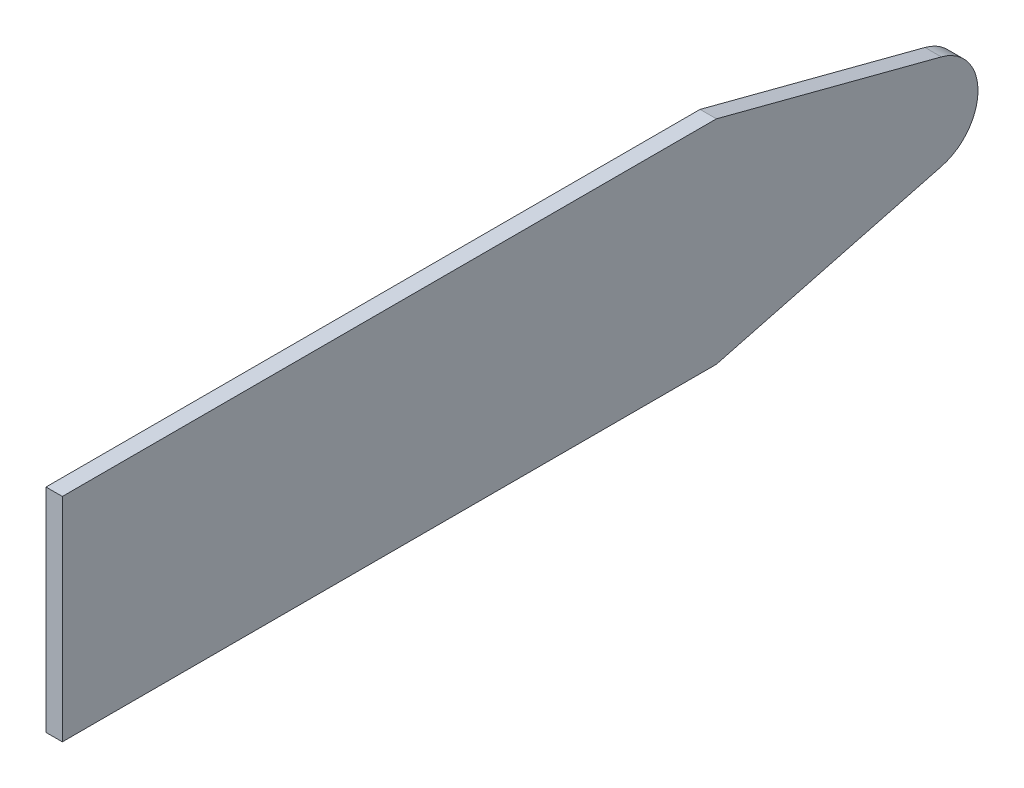
ISO-10303-21;
HEADER;
FILE_DESCRIPTION(('STEP AP214'),'2;1');
FILE_NAME('part.step','',(''),(''),'','','');
FILE_SCHEMA(('AUTOMOTIVE_DESIGN { 1 0 10303 214 1 1 1 1 }'));
ENDSEC;
DATA;
#1=APPLICATION_CONTEXT('core data for automotive mechanical design processes');
#2=APPLICATION_PROTOCOL_DEFINITION('international standard','automotive_design',2000,#1);
#3=PRODUCT_CONTEXT('',#1,'mechanical');
#4=PRODUCT('Part','Part','',(#3));
#5=PRODUCT_RELATED_PRODUCT_CATEGORY('part','',(#4));
#6=PRODUCT_DEFINITION_FORMATION('','',#4);
#7=PRODUCT_DEFINITION_CONTEXT('part definition',#1,'design');
#8=PRODUCT_DEFINITION('design','',#6,#7);
#9=PRODUCT_DEFINITION_SHAPE('','',#8);
#10=(LENGTH_UNIT() NAMED_UNIT(*) SI_UNIT(.MILLI.,.METRE.));
#11=(NAMED_UNIT(*) PLANE_ANGLE_UNIT() SI_UNIT($,.RADIAN.));
#12=(NAMED_UNIT(*) SI_UNIT($,.STERADIAN.) SOLID_ANGLE_UNIT());
#13=UNCERTAINTY_MEASURE_WITH_UNIT(LENGTH_MEASURE(1.E-05),#10,'distance_accuracy_value','');
#14=(GEOMETRIC_REPRESENTATION_CONTEXT(3) GLOBAL_UNCERTAINTY_ASSIGNED_CONTEXT((#13)) GLOBAL_UNIT_ASSIGNED_CONTEXT((#10,
#11,#12)) REPRESENTATION_CONTEXT('',''));
#15=CARTESIAN_POINT('',(0.,0.,0.));
#16=DIRECTION('',(0.,0.,1.));
#17=DIRECTION('',(1.,0.,0.));
#18=AXIS2_PLACEMENT_3D('',#15,#16,#17);
#19=CARTESIAN_POINT('',(10.,0.,0.));
#20=DIRECTION('',(-1.,0.,0.));
#21=DIRECTION('',(0.,0.,1.));
#22=AXIS2_PLACEMENT_3D('',#19,#20,#21);
#23=CYLINDRICAL_SURFACE('',#22,30.);
#24=CARTESIAN_POINT('',(0.,0.,0.));
#25=DIRECTION('',(1.,0.,0.));
#26=DIRECTION('',(0.,0.,-1.));
#27=AXIS2_PLACEMENT_3D('',#24,#25,#26);
#28=CIRCLE('',#27,30.);
#29=CARTESIAN_POINT('',(0.,-29.0242387446053,-7.58904244922575));
#30=VERTEX_POINT('',#29);
#31=CARTESIAN_POINT('',(0.,29.0242387446053,-7.58904244922576));
#32=VERTEX_POINT('',#31);
#33=EDGE_CURVE('E118',#30,#32,#28,.T.);
#34=ORIENTED_EDGE('',*,*,#33,.T.);
#35=DIRECTION('',(-1.,0.,0.));
#36=VECTOR('',#35,1.);
#37=CARTESIAN_POINT('',(10.,29.0242387446053,-7.58904244922576));
#38=LINE('',#37,#36);
#39=CARTESIAN_POINT('',(10.,29.0242387446053,-7.58904244922576));
#40=VERTEX_POINT('',#39);
#41=EDGE_CURVE('E11',#40,#32,#38,.T.);
#42=ORIENTED_EDGE('',*,*,#41,.F.);
#43=CARTESIAN_POINT('',(10.,0.,0.));
#44=DIRECTION('',(1.,0.,0.));
#45=DIRECTION('',(0.,0.,-1.));
#46=AXIS2_PLACEMENT_3D('',#43,#44,#45);
#47=CIRCLE('',#46,30.);
#48=CARTESIAN_POINT('',(10.,-29.0242387446053,-7.58904244922575));
#49=VERTEX_POINT('',#48);
#50=EDGE_CURVE('E128',#49,#40,#47,.T.);
#51=ORIENTED_EDGE('',*,*,#50,.F.);
#52=DIRECTION('',(-1.,0.,0.));
#53=VECTOR('',#52,1.);
#54=CARTESIAN_POINT('',(10.,-29.0242387446053,-7.58904244922575));
#55=LINE('',#54,#53);
#56=EDGE_CURVE('E114',#49,#30,#55,.T.);
#57=ORIENTED_EDGE('',*,*,#56,.T.);
#58=EDGE_LOOP('',(#34,#42,#51,#57));
#59=FACE_BOUND('',#58,.T.);
#60=ADVANCED_FACE('F34',(#59),#23,.T.);
#61=CARTESIAN_POINT('',(10.,29.0242387446053,-7.58904244922576));
#62=DIRECTION('',(0.,-0.967474624820178,0.252968081640859));
#63=DIRECTION('',(0.,-0.252968081640859,-0.967474624820178));
#64=AXIS2_PLACEMENT_3D('',#61,#62,#63);
#65=PLANE('',#64);
#66=DIRECTION('',(0.,0.252968081640859,0.967474624820178));
#67=VECTOR('',#66,1.);
#68=CARTESIAN_POINT('',(0.,29.0242387446053,-7.58904244922576));
#69=LINE('',#68,#67);
#70=CARTESIAN_POINT('',(0.,65.0000000000001,130.));
#71=VERTEX_POINT('',#70);
#72=EDGE_CURVE('E121',#32,#71,#69,.T.);
#73=ORIENTED_EDGE('',*,*,#72,.T.);
#74=DIRECTION('',(-1.,0.,0.));
#75=VECTOR('',#74,1.);
#76=CARTESIAN_POINT('',(10.,65.0000000000001,130.));
#77=LINE('',#76,#75);
#78=CARTESIAN_POINT('',(10.,65.0000000000001,130.));
#79=VERTEX_POINT('',#78);
#80=EDGE_CURVE('E42',#79,#71,#77,.T.);
#81=ORIENTED_EDGE('',*,*,#80,.F.);
#82=DIRECTION('',(0.,0.252968081640859,0.967474624820178));
#83=VECTOR('',#82,1.);
#84=CARTESIAN_POINT('',(10.,29.0242387446053,-7.58904244922576));
#85=LINE('',#84,#83);
#86=EDGE_CURVE('E87',#40,#79,#85,.T.);
#87=ORIENTED_EDGE('',*,*,#86,.F.);
#88=ORIENTED_EDGE('',*,*,#41,.T.);
#89=EDGE_LOOP('',(#73,#81,#87,#88));
#90=FACE_BOUND('',#89,.T.);
#91=ADVANCED_FACE('F152',(#90),#65,.F.);
#92=CARTESIAN_POINT('',(10.,65.0000000000001,130.));
#93=DIRECTION('',(0.,-1.,0.));
#94=DIRECTION('',(0.,0.,-1.));
#95=AXIS2_PLACEMENT_3D('',#92,#93,#94);
#96=PLANE('',#95);
#97=DIRECTION('',(0.,0.,1.));
#98=VECTOR('',#97,1.);
#99=CARTESIAN_POINT('',(0.,65.0000000000001,130.));
#100=LINE('',#99,#98);
#101=CARTESIAN_POINT('',(0.,65.,530.));
#102=VERTEX_POINT('',#101);
#103=EDGE_CURVE('E123',#71,#102,#100,.T.);
#104=ORIENTED_EDGE('',*,*,#103,.T.);
#105=DIRECTION('',(-1.,0.,0.));
#106=VECTOR('',#105,1.);
#107=CARTESIAN_POINT('',(10.,65.,530.));
#108=LINE('',#107,#106);
#109=CARTESIAN_POINT('',(10.,65.,530.));
#110=VERTEX_POINT('',#109);
#111=EDGE_CURVE('E109',#110,#102,#108,.T.);
#112=ORIENTED_EDGE('',*,*,#111,.F.);
#113=DIRECTION('',(0.,0.,1.));
#114=VECTOR('',#113,1.);
#115=CARTESIAN_POINT('',(10.,65.0000000000001,130.));
#116=LINE('',#115,#114);
#117=EDGE_CURVE('E100',#79,#110,#116,.T.);
#118=ORIENTED_EDGE('',*,*,#117,.F.);
#119=ORIENTED_EDGE('',*,*,#80,.T.);
#120=EDGE_LOOP('',(#104,#112,#118,#119));
#121=FACE_BOUND('',#120,.T.);
#122=ADVANCED_FACE('F134',(#121),#96,.F.);
#123=CARTESIAN_POINT('',(10.,65.,530.));
#124=DIRECTION('',(0.,0.,-1.));
#125=DIRECTION('',(-1.,0.,0.));
#126=AXIS2_PLACEMENT_3D('',#123,#124,#125);
#127=PLANE('',#126);
#128=DIRECTION('',(0.,-1.,0.));
#129=VECTOR('',#128,1.);
#130=CARTESIAN_POINT('',(0.,65.,530.));
#131=LINE('',#130,#129);
#132=CARTESIAN_POINT('',(0.,-65.,530.));
#133=VERTEX_POINT('',#132);
#134=EDGE_CURVE('E108',#102,#133,#131,.T.);
#135=ORIENTED_EDGE('',*,*,#134,.T.);
#136=DIRECTION('',(-1.,0.,0.));
#137=VECTOR('',#136,1.);
#138=CARTESIAN_POINT('',(10.,-65.,530.));
#139=LINE('',#138,#137);
#140=CARTESIAN_POINT('',(10.,-65.,530.));
#141=VERTEX_POINT('',#140);
#142=EDGE_CURVE('E105',#141,#133,#139,.T.);
#143=ORIENTED_EDGE('',*,*,#142,.F.);
#144=DIRECTION('',(0.,-1.,0.));
#145=VECTOR('',#144,1.);
#146=CARTESIAN_POINT('',(10.,65.,530.));
#147=LINE('',#146,#145);
#148=EDGE_CURVE('E94',#110,#141,#147,.T.);
#149=ORIENTED_EDGE('',*,*,#148,.F.);
#150=ORIENTED_EDGE('',*,*,#111,.T.);
#151=EDGE_LOOP('',(#135,#143,#149,#150));
#152=FACE_BOUND('',#151,.T.);
#153=ADVANCED_FACE('F106',(#152),#127,.F.);
#154=CARTESIAN_POINT('',(10.,-65.,530.));
#155=DIRECTION('',(0.,1.,0.));
#156=DIRECTION('',(0.,0.,1.));
#157=AXIS2_PLACEMENT_3D('',#154,#155,#156);
#158=PLANE('',#157);
#159=DIRECTION('',(0.,0.,-1.));
#160=VECTOR('',#159,1.);
#161=CARTESIAN_POINT('',(0.,-65.,530.));
#162=LINE('',#161,#160);
#163=CARTESIAN_POINT('',(0.,-65.,130.));
#164=VERTEX_POINT('',#163);
#165=EDGE_CURVE('E73',#133,#164,#162,.T.);
#166=ORIENTED_EDGE('',*,*,#165,.T.);
#167=DIRECTION('',(-1.,0.,0.));
#168=VECTOR('',#167,1.);
#169=CARTESIAN_POINT('',(10.,-65.,130.));
#170=LINE('',#169,#168);
#171=CARTESIAN_POINT('',(10.,-65.,130.));
#172=VERTEX_POINT('',#171);
#173=EDGE_CURVE('E110',#172,#164,#170,.T.);
#174=ORIENTED_EDGE('',*,*,#173,.F.);
#175=DIRECTION('',(0.,0.,-1.));
#176=VECTOR('',#175,1.);
#177=CARTESIAN_POINT('',(10.,-65.,530.));
#178=LINE('',#177,#176);
#179=EDGE_CURVE('E98',#141,#172,#178,.T.);
#180=ORIENTED_EDGE('',*,*,#179,.F.);
#181=ORIENTED_EDGE('',*,*,#142,.T.);
#182=EDGE_LOOP('',(#166,#174,#180,#181));
#183=FACE_BOUND('',#182,.T.);
#184=ADVANCED_FACE('F112',(#183),#158,.F.);
#185=CARTESIAN_POINT('',(10.,-65.,130.));
#186=DIRECTION('',(0.,0.967474624820178,0.252968081640858));
#187=DIRECTION('',(0.,-0.252968081640858,0.967474624820178));
#188=AXIS2_PLACEMENT_3D('',#185,#186,#187);
#189=PLANE('',#188);
#190=DIRECTION('',(0.,0.252968081640858,-0.967474624820178));
#191=VECTOR('',#190,1.);
#192=CARTESIAN_POINT('',(0.,-65.,130.));
#193=LINE('',#192,#191);
#194=EDGE_CURVE('E79',#164,#30,#193,.T.);
#195=ORIENTED_EDGE('',*,*,#194,.T.);
#196=ORIENTED_EDGE('',*,*,#56,.F.);
#197=DIRECTION('',(0.,0.252968081640858,-0.967474624820178));
#198=VECTOR('',#197,1.);
#199=CARTESIAN_POINT('',(10.,-65.,130.));
#200=LINE('',#199,#198);
#201=EDGE_CURVE('E50',#172,#49,#200,.T.);
#202=ORIENTED_EDGE('',*,*,#201,.F.);
#203=ORIENTED_EDGE('',*,*,#173,.T.);
#204=EDGE_LOOP('',(#195,#196,#202,#203));
#205=FACE_BOUND('',#204,.T.);
#206=ADVANCED_FACE('F141',(#205),#189,.F.);
#207=CARTESIAN_POINT('',(10.,0.,0.));
#208=DIRECTION('',(1.,0.,0.));
#209=DIRECTION('',(0.,0.,-1.));
#210=AXIS2_PLACEMENT_3D('',#207,#208,#209);
#211=PLANE('',#210);
#212=ORIENTED_EDGE('',*,*,#50,.T.);
#213=ORIENTED_EDGE('',*,*,#86,.T.);
#214=ORIENTED_EDGE('',*,*,#117,.T.);
#215=ORIENTED_EDGE('',*,*,#148,.T.);
#216=ORIENTED_EDGE('',*,*,#179,.T.);
#217=ORIENTED_EDGE('',*,*,#201,.T.);
#218=EDGE_LOOP('',(#212,#213,#214,#215,#216,#217));
#219=FACE_BOUND('',#218,.T.);
#220=ADVANCED_FACE('F96',(#219),#211,.T.);
#221=CARTESIAN_POINT('',(0.,0.,0.));
#222=DIRECTION('',(1.,0.,0.));
#223=DIRECTION('',(0.,0.,-1.));
#224=AXIS2_PLACEMENT_3D('',#221,#222,#223);
#225=PLANE('',#224);
#226=ORIENTED_EDGE('',*,*,#33,.F.);
#227=ORIENTED_EDGE('',*,*,#194,.F.);
#228=ORIENTED_EDGE('',*,*,#165,.F.);
#229=ORIENTED_EDGE('',*,*,#134,.F.);
#230=ORIENTED_EDGE('',*,*,#103,.F.);
#231=ORIENTED_EDGE('',*,*,#72,.F.);
#232=EDGE_LOOP('',(#226,#227,#228,#229,#230,#231));
#233=FACE_BOUND('',#232,.T.);
#234=ADVANCED_FACE('F137',(#233),#225,.F.);
#235=CLOSED_SHELL('',(#60,#91,#122,#153,#184,#206,#220,#234));
#236=MANIFOLD_SOLID_BREP('B2',#235);
#237=ADVANCED_BREP_SHAPE_REPRESENTATION('',(#18,#236),#14);
#238=SHAPE_DEFINITION_REPRESENTATION(#9,#237);
ENDSEC;
END-ISO-10303-21;
